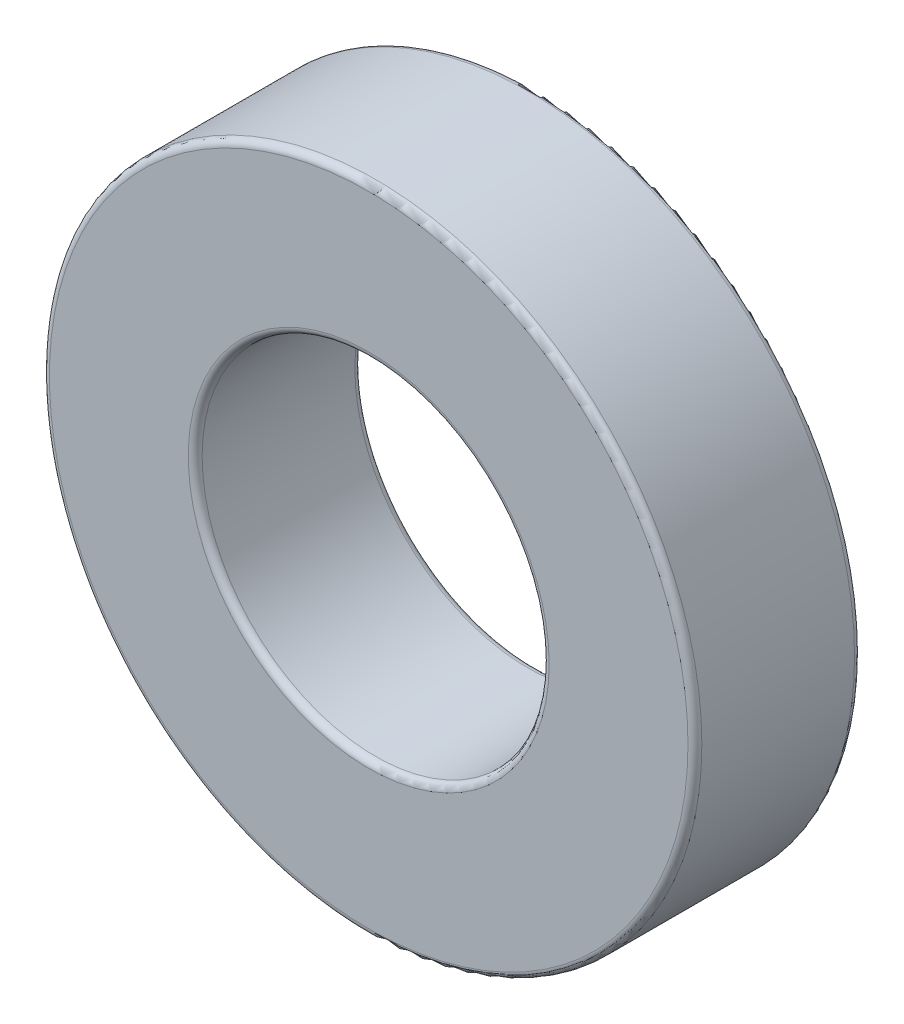
ISO-10303-21;
HEADER;
FILE_DESCRIPTION(('STEP AP214'),'2;1');
FILE_NAME('part.step','',(''),(''),'','','');
FILE_SCHEMA(('AUTOMOTIVE_DESIGN { 1 0 10303 214 1 1 1 1 }'));
ENDSEC;
DATA;
#1=APPLICATION_CONTEXT('core data for automotive mechanical design processes');
#2=APPLICATION_PROTOCOL_DEFINITION('international standard','automotive_design',2000,#1);
#3=PRODUCT_CONTEXT('',#1,'mechanical');
#4=PRODUCT('Part','Part','',(#3));
#5=PRODUCT_RELATED_PRODUCT_CATEGORY('part','',(#4));
#6=PRODUCT_DEFINITION_FORMATION('','',#4);
#7=PRODUCT_DEFINITION_CONTEXT('part definition',#1,'design');
#8=PRODUCT_DEFINITION('design','',#6,#7);
#9=PRODUCT_DEFINITION_SHAPE('','',#8);
#10=(LENGTH_UNIT() NAMED_UNIT(*) SI_UNIT(.MILLI.,.METRE.));
#11=(NAMED_UNIT(*) PLANE_ANGLE_UNIT() SI_UNIT($,.RADIAN.));
#12=(NAMED_UNIT(*) SI_UNIT($,.STERADIAN.) SOLID_ANGLE_UNIT());
#13=UNCERTAINTY_MEASURE_WITH_UNIT(LENGTH_MEASURE(1.E-05),#10,'distance_accuracy_value','');
#14=(GEOMETRIC_REPRESENTATION_CONTEXT(3) GLOBAL_UNCERTAINTY_ASSIGNED_CONTEXT((#13)) GLOBAL_UNIT_ASSIGNED_CONTEXT((#10,
#11,#12)) REPRESENTATION_CONTEXT('',''));
#15=CARTESIAN_POINT('',(0.,0.,0.));
#16=DIRECTION('',(0.,0.,1.));
#17=DIRECTION('',(1.,0.,0.));
#18=AXIS2_PLACEMENT_3D('',#15,#16,#17);
#19=CARTESIAN_POINT('',(0.,0.,12.));
#20=DIRECTION('',(0.,0.,1.));
#21=DIRECTION('',(1.,0.,0.));
#22=AXIS2_PLACEMENT_3D('',#19,#20,#21);
#23=PLANE('',#22);
#24=CARTESIAN_POINT('',(0.,0.,12.));
#25=DIRECTION('',(0.,0.,1.));
#26=DIRECTION('',(1.,0.,0.));
#27=AXIS2_PLACEMENT_3D('',#24,#25,#26);
#28=CIRCLE('',#27,13.);
#29=CARTESIAN_POINT('',(13.,0.,12.));
#30=VERTEX_POINT('',#29);
#31=EDGE_CURVE('E10',#30,#30,#28,.F.);
#32=ORIENTED_EDGE('',*,*,#31,.T.);
#33=EDGE_LOOP('',(#32));
#34=FACE_BOUND('',#33,.T.);
#35=CARTESIAN_POINT('',(0.,0.,12.));
#36=DIRECTION('',(0.,0.,1.));
#37=DIRECTION('',(1.,0.,0.));
#38=AXIS2_PLACEMENT_3D('',#35,#36,#37);
#39=CIRCLE('',#38,23.);
#40=CARTESIAN_POINT('',(23.,0.,12.));
#41=VERTEX_POINT('',#40);
#42=EDGE_CURVE('E57',#41,#41,#39,.T.);
#43=ORIENTED_EDGE('',*,*,#42,.T.);
#44=EDGE_LOOP('',(#43));
#45=FACE_BOUND('',#44,.T.);
#46=ADVANCED_FACE('F37',(#34,#45),#23,.T.);
#47=CARTESIAN_POINT('',(0.,0.,0.));
#48=DIRECTION('',(0.,0.,1.));
#49=DIRECTION('',(1.,0.,0.));
#50=AXIS2_PLACEMENT_3D('',#47,#48,#49);
#51=PLANE('',#50);
#52=CARTESIAN_POINT('',(0.,0.,0.));
#53=DIRECTION('',(0.,0.,1.));
#54=DIRECTION('',(1.,0.,0.));
#55=AXIS2_PLACEMENT_3D('',#52,#53,#54);
#56=CIRCLE('',#55,13.);
#57=CARTESIAN_POINT('',(13.,0.,0.));
#58=VERTEX_POINT('',#57);
#59=EDGE_CURVE('E52',#58,#58,#56,.T.);
#60=ORIENTED_EDGE('',*,*,#59,.T.);
#61=EDGE_LOOP('',(#60));
#62=FACE_BOUND('',#61,.T.);
#63=CARTESIAN_POINT('',(0.,0.,0.));
#64=DIRECTION('',(0.,0.,1.));
#65=DIRECTION('',(1.,0.,0.));
#66=AXIS2_PLACEMENT_3D('',#63,#64,#65);
#67=CIRCLE('',#66,23.);
#68=CARTESIAN_POINT('',(23.,0.,0.));
#69=VERTEX_POINT('',#68);
#70=EDGE_CURVE('E60',#69,#69,#67,.F.);
#71=ORIENTED_EDGE('',*,*,#70,.T.);
#72=EDGE_LOOP('',(#71));
#73=FACE_BOUND('',#72,.T.);
#74=ADVANCED_FACE('F81',(#62,#73),#51,.F.);
#75=CARTESIAN_POINT('',(0.,0.,12.));
#76=DIRECTION('',(0.,0.,-1.));
#77=DIRECTION('',(-1.,0.,0.));
#78=AXIS2_PLACEMENT_3D('',#75,#76,#77);
#79=CYLINDRICAL_SURFACE('',#78,23.5);
#80=CARTESIAN_POINT('',(0.,0.,0.5));
#81=DIRECTION('',(0.,0.,1.));
#82=DIRECTION('',(1.,0.,0.));
#83=AXIS2_PLACEMENT_3D('',#80,#81,#82);
#84=CIRCLE('',#83,23.5);
#85=CARTESIAN_POINT('',(23.5,0.,0.5));
#86=VERTEX_POINT('',#85);
#87=EDGE_CURVE('E63',#86,#86,#84,.T.);
#88=ORIENTED_EDGE('',*,*,#87,.T.);
#89=EDGE_LOOP('',(#88));
#90=FACE_BOUND('',#89,.T.);
#91=CARTESIAN_POINT('',(0.,0.,11.5));
#92=DIRECTION('',(0.,0.,1.));
#93=DIRECTION('',(1.,0.,0.));
#94=AXIS2_PLACEMENT_3D('',#91,#92,#93);
#95=CIRCLE('',#94,23.5);
#96=CARTESIAN_POINT('',(23.5,0.,11.5));
#97=VERTEX_POINT('',#96);
#98=EDGE_CURVE('E66',#97,#97,#95,.F.);
#99=ORIENTED_EDGE('',*,*,#98,.T.);
#100=EDGE_LOOP('',(#99));
#101=FACE_BOUND('',#100,.T.);
#102=ADVANCED_FACE('F70',(#90,#101),#79,.T.);
#103=CARTESIAN_POINT('',(0.,0.,12.));
#104=DIRECTION('',(0.,0.,-1.));
#105=DIRECTION('',(-1.,0.,0.));
#106=AXIS2_PLACEMENT_3D('',#103,#104,#105);
#107=CYLINDRICAL_SURFACE('',#106,12.5);
#108=CARTESIAN_POINT('',(0.,0.,0.5));
#109=DIRECTION('',(0.,0.,1.));
#110=DIRECTION('',(1.,0.,0.));
#111=AXIS2_PLACEMENT_3D('',#108,#109,#110);
#112=CIRCLE('',#111,12.5);
#113=CARTESIAN_POINT('',(12.5,0.,0.5));
#114=VERTEX_POINT('',#113);
#115=EDGE_CURVE('E44',#114,#114,#112,.F.);
#116=ORIENTED_EDGE('',*,*,#115,.T.);
#117=EDGE_LOOP('',(#116));
#118=FACE_BOUND('',#117,.T.);
#119=CARTESIAN_POINT('',(0.,0.,11.5));
#120=DIRECTION('',(0.,0.,1.));
#121=DIRECTION('',(1.,0.,0.));
#122=AXIS2_PLACEMENT_3D('',#119,#120,#121);
#123=CIRCLE('',#122,12.5);
#124=CARTESIAN_POINT('',(12.5,0.,11.5));
#125=VERTEX_POINT('',#124);
#126=EDGE_CURVE('E48',#125,#125,#123,.T.);
#127=ORIENTED_EDGE('',*,*,#126,.T.);
#128=EDGE_LOOP('',(#127));
#129=FACE_BOUND('',#128,.T.);
#130=ADVANCED_FACE('F89',(#118,#129),#107,.F.);
#131=CARTESIAN_POINT('',(0.,0.,0.5));
#132=DIRECTION('',(0.,0.,1.));
#133=DIRECTION('',(1.,0.,0.));
#134=AXIS2_PLACEMENT_3D('',#131,#132,#133);
#135=TOROIDAL_SURFACE('',#134,23.,0.5);
#136=ORIENTED_EDGE('',*,*,#70,.F.);
#137=EDGE_LOOP('',(#136));
#138=FACE_BOUND('',#137,.T.);
#139=ORIENTED_EDGE('',*,*,#87,.F.);
#140=EDGE_LOOP('',(#139));
#141=FACE_BOUND('',#140,.T.);
#142=ADVANCED_FACE('F76',(#138,#141),#135,.T.);
#143=CARTESIAN_POINT('',(0.,0.,11.5));
#144=DIRECTION('',(0.,0.,1.));
#145=DIRECTION('',(1.,0.,0.));
#146=AXIS2_PLACEMENT_3D('',#143,#144,#145);
#147=TOROIDAL_SURFACE('',#146,23.,0.5);
#148=ORIENTED_EDGE('',*,*,#98,.F.);
#149=EDGE_LOOP('',(#148));
#150=FACE_BOUND('',#149,.T.);
#151=ORIENTED_EDGE('',*,*,#42,.F.);
#152=EDGE_LOOP('',(#151));
#153=FACE_BOUND('',#152,.T.);
#154=ADVANCED_FACE('F72',(#150,#153),#147,.T.);
#155=CARTESIAN_POINT('',(0.,0.,0.5));
#156=DIRECTION('',(0.,0.,1.));
#157=DIRECTION('',(1.,0.,0.));
#158=AXIS2_PLACEMENT_3D('',#155,#156,#157);
#159=TOROIDAL_SURFACE('',#158,13.,0.5);
#160=ORIENTED_EDGE('',*,*,#115,.F.);
#161=EDGE_LOOP('',(#160));
#162=FACE_BOUND('',#161,.T.);
#163=ORIENTED_EDGE('',*,*,#59,.F.);
#164=EDGE_LOOP('',(#163));
#165=FACE_BOUND('',#164,.T.);
#166=ADVANCED_FACE('F75',(#162,#165),#159,.T.);
#167=CARTESIAN_POINT('',(0.,0.,11.5));
#168=DIRECTION('',(0.,0.,1.));
#169=DIRECTION('',(1.,0.,0.));
#170=AXIS2_PLACEMENT_3D('',#167,#168,#169);
#171=TOROIDAL_SURFACE('',#170,13.,0.5);
#172=ORIENTED_EDGE('',*,*,#31,.F.);
#173=EDGE_LOOP('',(#172));
#174=FACE_BOUND('',#173,.T.);
#175=ORIENTED_EDGE('',*,*,#126,.F.);
#176=EDGE_LOOP('',(#175));
#177=FACE_BOUND('',#176,.T.);
#178=ADVANCED_FACE('F39',(#174,#177),#171,.T.);
#179=CLOSED_SHELL('',(#46,#74,#102,#130,#142,#154,#166,#178));
#180=MANIFOLD_SOLID_BREP('B2',#179);
#181=ADVANCED_BREP_SHAPE_REPRESENTATION('',(#18,#180),#14);
#182=SHAPE_DEFINITION_REPRESENTATION(#9,#181);
ENDSEC;
END-ISO-10303-21;
